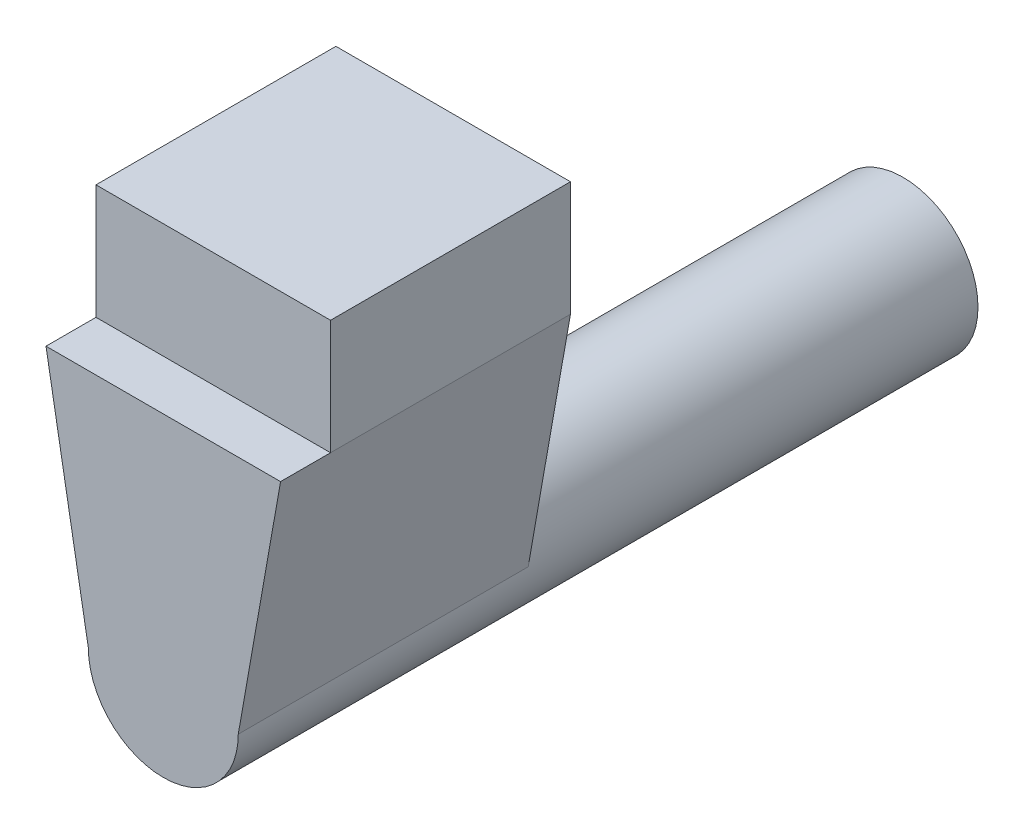
ISO-10303-21;
HEADER;
FILE_DESCRIPTION(('STEP AP214'),'2;1');
FILE_NAME('part.step','',(''),(''),'','','');
FILE_SCHEMA(('AUTOMOTIVE_DESIGN { 1 0 10303 214 1 1 1 1 }'));
ENDSEC;
DATA;
#1=APPLICATION_CONTEXT('core data for automotive mechanical design processes');
#2=APPLICATION_PROTOCOL_DEFINITION('international standard','automotive_design',2000,#1);
#3=PRODUCT_CONTEXT('',#1,'mechanical');
#4=PRODUCT('Part','Part','',(#3));
#5=PRODUCT_RELATED_PRODUCT_CATEGORY('part','',(#4));
#6=PRODUCT_DEFINITION_FORMATION('','',#4);
#7=PRODUCT_DEFINITION_CONTEXT('part definition',#1,'design');
#8=PRODUCT_DEFINITION('design','',#6,#7);
#9=PRODUCT_DEFINITION_SHAPE('','',#8);
#10=(LENGTH_UNIT() NAMED_UNIT(*) SI_UNIT(.MILLI.,.METRE.));
#11=(NAMED_UNIT(*) PLANE_ANGLE_UNIT() SI_UNIT($,.RADIAN.));
#12=(NAMED_UNIT(*) SI_UNIT($,.STERADIAN.) SOLID_ANGLE_UNIT());
#13=UNCERTAINTY_MEASURE_WITH_UNIT(LENGTH_MEASURE(1.E-05),#10,'distance_accuracy_value','');
#14=(GEOMETRIC_REPRESENTATION_CONTEXT(3) GLOBAL_UNCERTAINTY_ASSIGNED_CONTEXT((#13)) GLOBAL_UNIT_ASSIGNED_CONTEXT((#10,
#11,#12)) REPRESENTATION_CONTEXT('',''));
#15=CARTESIAN_POINT('',(0.,0.,0.));
#16=DIRECTION('',(0.,0.,1.));
#17=DIRECTION('',(1.,0.,0.));
#18=AXIS2_PLACEMENT_3D('',#15,#16,#17);
#19=CARTESIAN_POINT('',(-17.2191805697573,10.8609375,84.1917878));
#20=DIRECTION('',(0.,0.,-1.));
#21=DIRECTION('',(0.,-1.,0.));
#22=AXIS2_PLACEMENT_3D('',#19,#20,#21);
#23=PLANE('',#22);
#24=DIRECTION('',(-0.173648177666935,-0.984807753012207,0.));
#25=VECTOR('',#24,1.);
#26=CARTESIAN_POINT('',(31.5,-29.616325,84.1917878));
#27=LINE('',#26,#25);
#28=CARTESIAN_POINT('',(35.7318475370033,-5.61632499999992,84.1917878));
#29=VERTEX_POINT('',#28);
#30=CARTESIAN_POINT('',(31.5,-29.616325,84.1917878));
#31=VERTEX_POINT('',#30);
#32=EDGE_CURVE('E43',#29,#31,#27,.T.);
#33=ORIENTED_EDGE('',*,*,#32,.F.);
#34=DIRECTION('',(-1.,0.,0.));
#35=VECTOR('',#34,1.);
#36=CARTESIAN_POINT('',(35.7318475370033,-5.61632499999992,84.1917878));
#37=LINE('',#36,#35);
#38=CARTESIAN_POINT('',(12.2681524629967,-5.61632499999992,84.1917878));
#39=VERTEX_POINT('',#38);
#40=EDGE_CURVE('E146',#29,#39,#37,.T.);
#41=ORIENTED_EDGE('',*,*,#40,.T.);
#42=DIRECTION('',(-0.173648177666935,0.984807753012207,0.));
#43=VECTOR('',#42,1.);
#44=CARTESIAN_POINT('',(16.5,-29.616325,84.1917878));
#45=LINE('',#44,#43);
#46=CARTESIAN_POINT('',(16.5,-29.616325,84.1917878));
#47=VERTEX_POINT('',#46);
#48=EDGE_CURVE('E38',#47,#39,#45,.T.);
#49=ORIENTED_EDGE('',*,*,#48,.F.);
#50=CARTESIAN_POINT('',(24.,-29.616325,84.1917878));
#51=DIRECTION('',(0.,0.,-1.));
#52=DIRECTION('',(0.,1.,0.));
#53=AXIS2_PLACEMENT_3D('',#50,#51,#52);
#54=CIRCLE('',#53,7.5);
#55=EDGE_CURVE('E11',#31,#47,#54,.T.);
#56=ORIENTED_EDGE('',*,*,#55,.F.);
#57=EDGE_LOOP('',(#33,#41,#49,#56));
#58=FACE_BOUND('',#57,.T.);
#59=ADVANCED_FACE('F35',(#58),#23,.F.);
#60=CARTESIAN_POINT('',(24.,-29.616325,55.1917878));
#61=DIRECTION('',(0.,0.,1.));
#62=DIRECTION('',(1.,0.,0.));
#63=AXIS2_PLACEMENT_3D('',#60,#61,#62);
#64=PLANE('',#63);
#65=DIRECTION('',(0.173648177666935,0.984807753012207,0.));
#66=VECTOR('',#65,1.);
#67=CARTESIAN_POINT('',(31.5,-29.616325,55.1917878));
#68=LINE('',#67,#66);
#69=CARTESIAN_POINT('',(31.5,-29.616325,55.1917878));
#70=VERTEX_POINT('',#69);
#71=CARTESIAN_POINT('',(35.7318475370033,-5.616325,55.1917878));
#72=VERTEX_POINT('',#71);
#73=EDGE_CURVE('E97',#70,#72,#68,.T.);
#74=ORIENTED_EDGE('',*,*,#73,.F.);
#75=CARTESIAN_POINT('',(24.,-29.616325,55.1917878));
#76=DIRECTION('',(0.,0.,1.));
#77=DIRECTION('',(1.,0.,0.));
#78=AXIS2_PLACEMENT_3D('',#75,#76,#77);
#79=CIRCLE('',#78,7.5);
#80=CARTESIAN_POINT('',(16.5,-29.616325,55.1917878));
#81=VERTEX_POINT('',#80);
#82=EDGE_CURVE('E123',#70,#81,#79,.T.);
#83=ORIENTED_EDGE('',*,*,#82,.T.);
#84=DIRECTION('',(0.173648177666935,-0.984807753012207,0.));
#85=VECTOR('',#84,1.);
#86=CARTESIAN_POINT('',(16.5,-29.616325,55.1917878));
#87=LINE('',#86,#85);
#88=CARTESIAN_POINT('',(12.2681524629967,-5.616325,55.1917878));
#89=VERTEX_POINT('',#88);
#90=EDGE_CURVE('E116',#89,#81,#87,.T.);
#91=ORIENTED_EDGE('',*,*,#90,.F.);
#92=DIRECTION('',(0.,1.,0.));
#93=VECTOR('',#92,1.);
#94=CARTESIAN_POINT('',(12.2681524629967,-5.616325,55.1917878));
#95=LINE('',#94,#93);
#96=CARTESIAN_POINT('',(12.2681524629967,5.8609375,55.1917878));
#97=VERTEX_POINT('',#96);
#98=EDGE_CURVE('E101',#89,#97,#95,.T.);
#99=ORIENTED_EDGE('',*,*,#98,.T.);
#100=DIRECTION('',(-1.,0.,0.));
#101=VECTOR('',#100,1.);
#102=CARTESIAN_POINT('',(35.7318475370033,5.8609375,55.1917878));
#103=LINE('',#102,#101);
#104=CARTESIAN_POINT('',(35.7318475370033,5.8609375,55.1917878));
#105=VERTEX_POINT('',#104);
#106=EDGE_CURVE('E59',#105,#97,#103,.T.);
#107=ORIENTED_EDGE('',*,*,#106,.F.);
#108=DIRECTION('',(0.,1.,0.));
#109=VECTOR('',#108,1.);
#110=CARTESIAN_POINT('',(35.7318475370033,-5.616325,55.1917878));
#111=LINE('',#110,#109);
#112=EDGE_CURVE('E93',#72,#105,#111,.T.);
#113=ORIENTED_EDGE('',*,*,#112,.F.);
#114=EDGE_LOOP('',(#74,#83,#91,#99,#107,#113));
#115=FACE_BOUND('',#114,.T.);
#116=ADVANCED_FACE('F95',(#115),#64,.F.);
#117=CARTESIAN_POINT('',(16.5,-29.616325,123.470216823141));
#118=DIRECTION('',(0.984807753012207,0.173648177666935,0.));
#119=DIRECTION('',(-0.173648177666935,0.984807753012207,0.));
#120=AXIS2_PLACEMENT_3D('',#117,#118,#119);
#121=PLANE('',#120);
#122=DIRECTION('',(0.,0.,-1.));
#123=VECTOR('',#122,1.);
#124=CARTESIAN_POINT('',(16.5,-29.616325,123.470216823141));
#125=LINE('',#124,#123);
#126=EDGE_CURVE('E120',#47,#81,#125,.T.);
#127=ORIENTED_EDGE('',*,*,#126,.F.);
#128=ORIENTED_EDGE('',*,*,#48,.T.);
#129=DIRECTION('',(0.,0.,-1.));
#130=VECTOR('',#129,1.);
#131=CARTESIAN_POINT('',(12.2681524629967,-5.616325,123.470216823141));
#132=LINE('',#131,#130);
#133=CARTESIAN_POINT('',(12.2681524629967,-5.61632499999988,79.1917878));
#134=VERTEX_POINT('',#133);
#135=EDGE_CURVE('E109',#39,#134,#132,.T.);
#136=ORIENTED_EDGE('',*,*,#135,.T.);
#137=EDGE_CURVE('E129',#134,#89,#132,.T.);
#138=ORIENTED_EDGE('',*,*,#137,.T.);
#139=ORIENTED_EDGE('',*,*,#90,.T.);
#140=EDGE_LOOP('',(#127,#128,#136,#138,#139));
#141=FACE_BOUND('',#140,.T.);
#142=ADVANCED_FACE('F171',(#141),#121,.F.);
#143=CARTESIAN_POINT('',(31.5,-29.616325,123.470216823141));
#144=DIRECTION('',(-0.984807753012207,0.173648177666935,0.));
#145=DIRECTION('',(-0.173648177666935,-0.984807753012207,0.));
#146=AXIS2_PLACEMENT_3D('',#143,#144,#145);
#147=PLANE('',#146);
#148=DIRECTION('',(0.,0.,-1.));
#149=VECTOR('',#148,1.);
#150=CARTESIAN_POINT('',(35.7318475370033,-5.616325,123.470216823141));
#151=LINE('',#150,#149);
#152=CARTESIAN_POINT('',(35.7318475370033,-5.616325,79.1917878));
#153=VERTEX_POINT('',#152);
#154=EDGE_CURVE('E51',#29,#153,#151,.T.);
#155=ORIENTED_EDGE('',*,*,#154,.F.);
#156=ORIENTED_EDGE('',*,*,#32,.T.);
#157=DIRECTION('',(0.,0.,-1.));
#158=VECTOR('',#157,1.);
#159=CARTESIAN_POINT('',(31.5,-29.616325,123.470216823141));
#160=LINE('',#159,#158);
#161=EDGE_CURVE('E115',#31,#70,#160,.T.);
#162=ORIENTED_EDGE('',*,*,#161,.T.);
#163=ORIENTED_EDGE('',*,*,#73,.T.);
#164=EDGE_CURVE('E105',#153,#72,#151,.T.);
#165=ORIENTED_EDGE('',*,*,#164,.F.);
#166=EDGE_LOOP('',(#155,#156,#162,#163,#165));
#167=FACE_BOUND('',#166,.T.);
#168=ADVANCED_FACE('F112',(#167),#147,.F.);
#169=CARTESIAN_POINT('',(24.,-29.616325,123.470216823141));
#170=DIRECTION('',(0.,0.,-1.));
#171=DIRECTION('',(-1.,0.,0.));
#172=AXIS2_PLACEMENT_3D('',#169,#170,#171);
#173=CYLINDRICAL_SURFACE('',#172,7.5);
#174=ORIENTED_EDGE('',*,*,#161,.F.);
#175=ORIENTED_EDGE('',*,*,#55,.T.);
#176=ORIENTED_EDGE('',*,*,#126,.T.);
#177=ORIENTED_EDGE('',*,*,#82,.F.);
#178=EDGE_LOOP('',(#174,#175,#176,#177));
#179=FACE_BOUND('',#178,.T.);
#180=CARTESIAN_POINT('',(24.,-29.616325,10.1917878));
#181=DIRECTION('',(0.,0.,1.));
#182=DIRECTION('',(1.,0.,0.));
#183=AXIS2_PLACEMENT_3D('',#180,#181,#182);
#184=CIRCLE('',#183,7.5);
#185=CARTESIAN_POINT('',(31.5,-29.616325,10.1917878));
#186=VERTEX_POINT('',#185);
#187=EDGE_CURVE('E117',#186,#186,#184,.T.);
#188=ORIENTED_EDGE('',*,*,#187,.T.);
#189=EDGE_LOOP('',(#188));
#190=FACE_BOUND('',#189,.T.);
#191=ADVANCED_FACE('F169',(#179,#190),#173,.T.);
#192=CARTESIAN_POINT('',(24.,-29.616325,10.1917878));
#193=DIRECTION('',(0.,0.,1.));
#194=DIRECTION('',(1.,0.,0.));
#195=AXIS2_PLACEMENT_3D('',#192,#193,#194);
#196=PLANE('',#195);
#197=ORIENTED_EDGE('',*,*,#187,.F.);
#198=EDGE_LOOP('',(#197));
#199=FACE_BOUND('',#198,.T.);
#200=ADVANCED_FACE('F212',(#199),#196,.F.);
#201=CARTESIAN_POINT('',(12.2681524629967,5.8609375,10.1917878));
#202=DIRECTION('',(0.,1.,0.));
#203=DIRECTION('',(0.,0.,1.));
#204=AXIS2_PLACEMENT_3D('',#201,#202,#203);
#205=PLANE('',#204);
#206=ORIENTED_EDGE('',*,*,#106,.T.);
#207=DIRECTION('',(0.,0.,1.));
#208=VECTOR('',#207,1.);
#209=CARTESIAN_POINT('',(12.2681524629967,5.8609375,10.1917878));
#210=LINE('',#209,#208);
#211=CARTESIAN_POINT('',(12.2681524629967,5.8609375,79.1917878));
#212=VERTEX_POINT('',#211);
#213=EDGE_CURVE('E136',#97,#212,#210,.T.);
#214=ORIENTED_EDGE('',*,*,#213,.T.);
#215=DIRECTION('',(-1.,0.,0.));
#216=VECTOR('',#215,1.);
#217=CARTESIAN_POINT('',(35.7318475370033,5.8609375,79.1917878));
#218=LINE('',#217,#216);
#219=CARTESIAN_POINT('',(35.7318475370033,5.8609375,79.1917878));
#220=VERTEX_POINT('',#219);
#221=EDGE_CURVE('E142',#220,#212,#218,.T.);
#222=ORIENTED_EDGE('',*,*,#221,.F.);
#223=DIRECTION('',(0.,0.,1.));
#224=VECTOR('',#223,1.);
#225=CARTESIAN_POINT('',(35.7318475370033,5.8609375,10.1917878));
#226=LINE('',#225,#224);
#227=EDGE_CURVE('E138',#105,#220,#226,.T.);
#228=ORIENTED_EDGE('',*,*,#227,.F.);
#229=EDGE_LOOP('',(#206,#214,#222,#228));
#230=FACE_BOUND('',#229,.T.);
#231=ADVANCED_FACE('F160',(#230),#205,.T.);
#232=CARTESIAN_POINT('',(12.2681524629967,-5.616325,10.1917878));
#233=DIRECTION('',(-1.,0.,0.));
#234=DIRECTION('',(0.,0.,1.));
#235=AXIS2_PLACEMENT_3D('',#232,#233,#234);
#236=PLANE('',#235);
#237=ORIENTED_EDGE('',*,*,#98,.F.);
#238=ORIENTED_EDGE('',*,*,#137,.F.);
#239=DIRECTION('',(0.,-1.,0.));
#240=VECTOR('',#239,1.);
#241=CARTESIAN_POINT('',(12.2681524629967,5.8609375,79.1917878));
#242=LINE('',#241,#240);
#243=EDGE_CURVE('E149',#212,#134,#242,.T.);
#244=ORIENTED_EDGE('',*,*,#243,.F.);
#245=ORIENTED_EDGE('',*,*,#213,.F.);
#246=EDGE_LOOP('',(#237,#238,#244,#245));
#247=FACE_BOUND('',#246,.T.);
#248=ADVANCED_FACE('F163',(#247),#236,.T.);
#249=CARTESIAN_POINT('',(35.7318475370033,-5.616325,10.1917878));
#250=DIRECTION('',(1.,0.,0.));
#251=DIRECTION('',(0.,0.,-1.));
#252=AXIS2_PLACEMENT_3D('',#249,#250,#251);
#253=PLANE('',#252);
#254=ORIENTED_EDGE('',*,*,#112,.T.);
#255=ORIENTED_EDGE('',*,*,#227,.T.);
#256=DIRECTION('',(0.,-1.,0.));
#257=VECTOR('',#256,1.);
#258=CARTESIAN_POINT('',(35.7318475370033,5.8609375,79.1917878));
#259=LINE('',#258,#257);
#260=EDGE_CURVE('E107',#220,#153,#259,.T.);
#261=ORIENTED_EDGE('',*,*,#260,.T.);
#262=ORIENTED_EDGE('',*,*,#164,.T.);
#263=EDGE_LOOP('',(#254,#255,#261,#262));
#264=FACE_BOUND('',#263,.T.);
#265=ADVANCED_FACE('F106',(#264),#253,.T.);
#266=CARTESIAN_POINT('',(35.7318475370033,-5.61632499999992,84.1917878));
#267=DIRECTION('',(0.,-1.,0.));
#268=DIRECTION('',(0.,0.,-1.));
#269=AXIS2_PLACEMENT_3D('',#266,#267,#268);
#270=PLANE('',#269);
#271=ORIENTED_EDGE('',*,*,#135,.F.);
#272=ORIENTED_EDGE('',*,*,#40,.F.);
#273=ORIENTED_EDGE('',*,*,#154,.T.);
#274=DIRECTION('',(-1.,0.,0.));
#275=VECTOR('',#274,1.);
#276=CARTESIAN_POINT('',(35.7318475370033,-5.61632499999988,79.1917878));
#277=LINE('',#276,#275);
#278=EDGE_CURVE('E144',#153,#134,#277,.T.);
#279=ORIENTED_EDGE('',*,*,#278,.T.);
#280=EDGE_LOOP('',(#271,#272,#273,#279));
#281=FACE_BOUND('',#280,.T.);
#282=ADVANCED_FACE('F166',(#281),#270,.F.);
#283=CARTESIAN_POINT('',(35.7318475370033,5.8609375,79.1917878));
#284=DIRECTION('',(0.,0.,-1.));
#285=DIRECTION('',(-1.,0.,0.));
#286=AXIS2_PLACEMENT_3D('',#283,#284,#285);
#287=PLANE('',#286);
#288=ORIENTED_EDGE('',*,*,#243,.T.);
#289=ORIENTED_EDGE('',*,*,#278,.F.);
#290=ORIENTED_EDGE('',*,*,#260,.F.);
#291=ORIENTED_EDGE('',*,*,#221,.T.);
#292=EDGE_LOOP('',(#288,#289,#290,#291));
#293=FACE_BOUND('',#292,.T.);
#294=ADVANCED_FACE('F165',(#293),#287,.F.);
#295=CLOSED_SHELL('',(#59,#116,#142,#168,#191,#200,#231,#248,#265,#282,#294));
#296=MANIFOLD_SOLID_BREP('B2',#295);
#297=ADVANCED_BREP_SHAPE_REPRESENTATION('',(#18,#296),#14);
#298=SHAPE_DEFINITION_REPRESENTATION(#9,#297);
ENDSEC;
END-ISO-10303-21;
